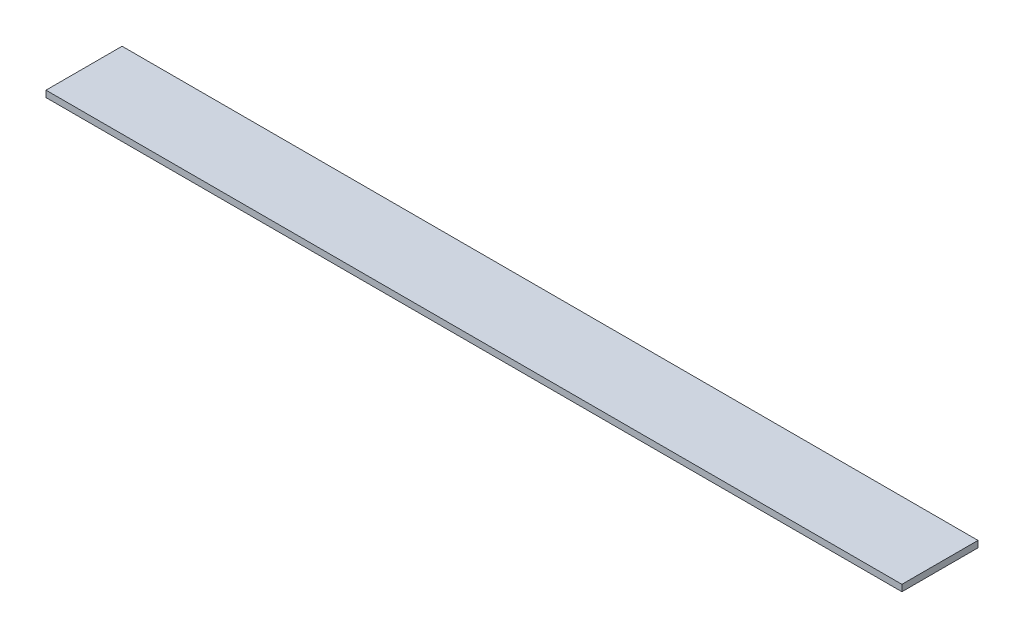
ISO-10303-21;
HEADER;
FILE_DESCRIPTION(('STEP AP214'),'2;1');
FILE_NAME('part.step','',(''),(''),'','','');
FILE_SCHEMA(('AUTOMOTIVE_DESIGN { 1 0 10303 214 1 1 1 1 }'));
ENDSEC;
DATA;
#1=APPLICATION_CONTEXT('core data for automotive mechanical design processes');
#2=APPLICATION_PROTOCOL_DEFINITION('international standard','automotive_design',2000,#1);
#3=PRODUCT_CONTEXT('',#1,'mechanical');
#4=PRODUCT('Part','Part','',(#3));
#5=PRODUCT_RELATED_PRODUCT_CATEGORY('part','',(#4));
#6=PRODUCT_DEFINITION_FORMATION('','',#4);
#7=PRODUCT_DEFINITION_CONTEXT('part definition',#1,'design');
#8=PRODUCT_DEFINITION('design','',#6,#7);
#9=PRODUCT_DEFINITION_SHAPE('','',#8);
#10=(LENGTH_UNIT() NAMED_UNIT(*) SI_UNIT(.MILLI.,.METRE.));
#11=(NAMED_UNIT(*) PLANE_ANGLE_UNIT() SI_UNIT($,.RADIAN.));
#12=(NAMED_UNIT(*) SI_UNIT($,.STERADIAN.) SOLID_ANGLE_UNIT());
#13=UNCERTAINTY_MEASURE_WITH_UNIT(LENGTH_MEASURE(1.E-05),#10,'distance_accuracy_value','');
#14=(GEOMETRIC_REPRESENTATION_CONTEXT(3) GLOBAL_UNCERTAINTY_ASSIGNED_CONTEXT((#13)) GLOBAL_UNIT_ASSIGNED_CONTEXT((#10,
#11,#12)) REPRESENTATION_CONTEXT('',''));
#15=CARTESIAN_POINT('',(0.,0.,0.));
#16=DIRECTION('',(0.,0.,1.));
#17=DIRECTION('',(1.,0.,0.));
#18=AXIS2_PLACEMENT_3D('',#15,#16,#17);
#19=CARTESIAN_POINT('',(112.5,1.7,-10.));
#20=DIRECTION('',(-1.,0.,0.));
#21=DIRECTION('',(0.,0.,1.));
#22=AXIS2_PLACEMENT_3D('',#19,#20,#21);
#23=PLANE('',#22);
#24=DIRECTION('',(0.,0.,-1.));
#25=VECTOR('',#24,1.);
#26=CARTESIAN_POINT('',(112.5,0.,-10.));
#27=LINE('',#26,#25);
#28=CARTESIAN_POINT('',(112.5,0.,10.));
#29=VERTEX_POINT('',#28);
#30=CARTESIAN_POINT('',(112.5,0.,-10.));
#31=VERTEX_POINT('',#30);
#32=EDGE_CURVE('E96',#29,#31,#27,.T.);
#33=ORIENTED_EDGE('',*,*,#32,.T.);
#34=DIRECTION('',(0.,-1.,0.));
#35=VECTOR('',#34,1.);
#36=CARTESIAN_POINT('',(112.5,1.7,-10.));
#37=LINE('',#36,#35);
#38=CARTESIAN_POINT('',(112.5,1.7,-10.));
#39=VERTEX_POINT('',#38);
#40=EDGE_CURVE('E11',#39,#31,#37,.T.);
#41=ORIENTED_EDGE('',*,*,#40,.F.);
#42=DIRECTION('',(0.,0.,-1.));
#43=VECTOR('',#42,1.);
#44=CARTESIAN_POINT('',(112.5,1.7,-10.));
#45=LINE('',#44,#43);
#46=CARTESIAN_POINT('',(112.5,1.7,10.));
#47=VERTEX_POINT('',#46);
#48=EDGE_CURVE('E84',#47,#39,#45,.T.);
#49=ORIENTED_EDGE('',*,*,#48,.F.);
#50=DIRECTION('',(0.,-1.,0.));
#51=VECTOR('',#50,1.);
#52=CARTESIAN_POINT('',(112.5,1.7,10.));
#53=LINE('',#52,#51);
#54=EDGE_CURVE('E92',#47,#29,#53,.T.);
#55=ORIENTED_EDGE('',*,*,#54,.T.);
#56=EDGE_LOOP('',(#33,#41,#49,#55));
#57=FACE_BOUND('',#56,.T.);
#58=ADVANCED_FACE('F33',(#57),#23,.F.);
#59=CARTESIAN_POINT('',(-112.5,1.7,-10.));
#60=DIRECTION('',(0.,0.,1.));
#61=DIRECTION('',(1.,0.,0.));
#62=AXIS2_PLACEMENT_3D('',#59,#60,#61);
#63=PLANE('',#62);
#64=DIRECTION('',(-1.,0.,0.));
#65=VECTOR('',#64,1.);
#66=CARTESIAN_POINT('',(-112.5,0.,-10.));
#67=LINE('',#66,#65);
#68=CARTESIAN_POINT('',(-112.5,0.,-10.));
#69=VERTEX_POINT('',#68);
#70=EDGE_CURVE('E88',#31,#69,#67,.T.);
#71=ORIENTED_EDGE('',*,*,#70,.T.);
#72=DIRECTION('',(0.,-1.,0.));
#73=VECTOR('',#72,1.);
#74=CARTESIAN_POINT('',(-112.5,1.7,-10.));
#75=LINE('',#74,#73);
#76=CARTESIAN_POINT('',(-112.5,1.7,-10.));
#77=VERTEX_POINT('',#76);
#78=EDGE_CURVE('E41',#77,#69,#75,.T.);
#79=ORIENTED_EDGE('',*,*,#78,.F.);
#80=DIRECTION('',(-1.,0.,0.));
#81=VECTOR('',#80,1.);
#82=CARTESIAN_POINT('',(-112.5,1.7,-10.));
#83=LINE('',#82,#81);
#84=EDGE_CURVE('E79',#39,#77,#83,.T.);
#85=ORIENTED_EDGE('',*,*,#84,.F.);
#86=ORIENTED_EDGE('',*,*,#40,.T.);
#87=EDGE_LOOP('',(#71,#79,#85,#86));
#88=FACE_BOUND('',#87,.T.);
#89=ADVANCED_FACE('F87',(#88),#63,.F.);
#90=CARTESIAN_POINT('',(-112.5,1.7,-10.));
#91=DIRECTION('',(1.,0.,0.));
#92=DIRECTION('',(0.,0.,-1.));
#93=AXIS2_PLACEMENT_3D('',#90,#91,#92);
#94=PLANE('',#93);
#95=DIRECTION('',(0.,0.,1.));
#96=VECTOR('',#95,1.);
#97=CARTESIAN_POINT('',(-112.5,0.,-10.));
#98=LINE('',#97,#96);
#99=CARTESIAN_POINT('',(-112.5,0.,10.));
#100=VERTEX_POINT('',#99);
#101=EDGE_CURVE('E66',#69,#100,#98,.T.);
#102=ORIENTED_EDGE('',*,*,#101,.T.);
#103=DIRECTION('',(0.,-1.,0.));
#104=VECTOR('',#103,1.);
#105=CARTESIAN_POINT('',(-112.5,1.7,10.));
#106=LINE('',#105,#104);
#107=CARTESIAN_POINT('',(-112.5,1.7,10.));
#108=VERTEX_POINT('',#107);
#109=EDGE_CURVE('E89',#108,#100,#106,.T.);
#110=ORIENTED_EDGE('',*,*,#109,.F.);
#111=DIRECTION('',(0.,0.,1.));
#112=VECTOR('',#111,1.);
#113=CARTESIAN_POINT('',(-112.5,1.7,-10.));
#114=LINE('',#113,#112);
#115=EDGE_CURVE('E82',#77,#108,#114,.T.);
#116=ORIENTED_EDGE('',*,*,#115,.F.);
#117=ORIENTED_EDGE('',*,*,#78,.T.);
#118=EDGE_LOOP('',(#102,#110,#116,#117));
#119=FACE_BOUND('',#118,.T.);
#120=ADVANCED_FACE('F90',(#119),#94,.F.);
#121=CARTESIAN_POINT('',(-112.5,1.7,10.));
#122=DIRECTION('',(0.,0.,-1.));
#123=DIRECTION('',(-1.,0.,0.));
#124=AXIS2_PLACEMENT_3D('',#121,#122,#123);
#125=PLANE('',#124);
#126=DIRECTION('',(1.,0.,0.));
#127=VECTOR('',#126,1.);
#128=CARTESIAN_POINT('',(-112.5,0.,10.));
#129=LINE('',#128,#127);
#130=EDGE_CURVE('E72',#100,#29,#129,.T.);
#131=ORIENTED_EDGE('',*,*,#130,.T.);
#132=ORIENTED_EDGE('',*,*,#54,.F.);
#133=DIRECTION('',(1.,0.,0.));
#134=VECTOR('',#133,1.);
#135=CARTESIAN_POINT('',(-112.5,1.7,10.));
#136=LINE('',#135,#134);
#137=EDGE_CURVE('E49',#108,#47,#136,.T.);
#138=ORIENTED_EDGE('',*,*,#137,.F.);
#139=ORIENTED_EDGE('',*,*,#109,.T.);
#140=EDGE_LOOP('',(#131,#132,#138,#139));
#141=FACE_BOUND('',#140,.T.);
#142=ADVANCED_FACE('F103',(#141),#125,.F.);
#143=CARTESIAN_POINT('',(0.,1.7,0.));
#144=DIRECTION('',(0.,1.,0.));
#145=DIRECTION('',(0.,0.,1.));
#146=AXIS2_PLACEMENT_3D('',#143,#144,#145);
#147=PLANE('',#146);
#148=ORIENTED_EDGE('',*,*,#48,.T.);
#149=ORIENTED_EDGE('',*,*,#84,.T.);
#150=ORIENTED_EDGE('',*,*,#115,.T.);
#151=ORIENTED_EDGE('',*,*,#137,.T.);
#152=EDGE_LOOP('',(#148,#149,#150,#151));
#153=FACE_BOUND('',#152,.T.);
#154=ADVANCED_FACE('F80',(#153),#147,.T.);
#155=CARTESIAN_POINT('',(0.,0.,0.));
#156=DIRECTION('',(0.,1.,0.));
#157=DIRECTION('',(0.,0.,1.));
#158=AXIS2_PLACEMENT_3D('',#155,#156,#157);
#159=PLANE('',#158);
#160=ORIENTED_EDGE('',*,*,#32,.F.);
#161=ORIENTED_EDGE('',*,*,#130,.F.);
#162=ORIENTED_EDGE('',*,*,#101,.F.);
#163=ORIENTED_EDGE('',*,*,#70,.F.);
#164=EDGE_LOOP('',(#160,#161,#162,#163));
#165=FACE_BOUND('',#164,.T.);
#166=ADVANCED_FACE('F106',(#165),#159,.F.);
#167=CLOSED_SHELL('',(#58,#89,#120,#142,#154,#166));
#168=MANIFOLD_SOLID_BREP('B2',#167);
#169=ADVANCED_BREP_SHAPE_REPRESENTATION('',(#18,#168),#14);
#170=SHAPE_DEFINITION_REPRESENTATION(#9,#169);
ENDSEC;
END-ISO-10303-21;
